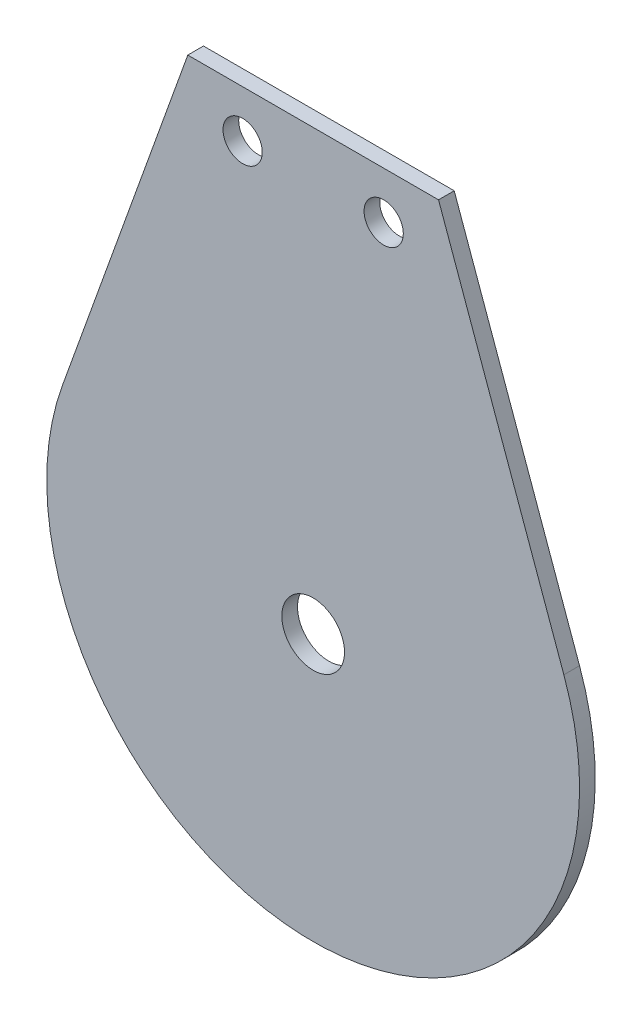
ISO-10303-21;
HEADER;
FILE_DESCRIPTION(('STEP AP214'),'2;1');
FILE_NAME('part.step','',(''),(''),'','','');
FILE_SCHEMA(('AUTOMOTIVE_DESIGN { 1 0 10303 214 1 1 1 1 }'));
ENDSEC;
DATA;
#1=APPLICATION_CONTEXT('core data for automotive mechanical design processes');
#2=APPLICATION_PROTOCOL_DEFINITION('international standard','automotive_design',2000,#1);
#3=PRODUCT_CONTEXT('',#1,'mechanical');
#4=PRODUCT('Part','Part','',(#3));
#5=PRODUCT_RELATED_PRODUCT_CATEGORY('part','',(#4));
#6=PRODUCT_DEFINITION_FORMATION('','',#4);
#7=PRODUCT_DEFINITION_CONTEXT('part definition',#1,'design');
#8=PRODUCT_DEFINITION('design','',#6,#7);
#9=PRODUCT_DEFINITION_SHAPE('','',#8);
#10=(LENGTH_UNIT() NAMED_UNIT(*) SI_UNIT(.MILLI.,.METRE.));
#11=(NAMED_UNIT(*) PLANE_ANGLE_UNIT() SI_UNIT($,.RADIAN.));
#12=(NAMED_UNIT(*) SI_UNIT($,.STERADIAN.) SOLID_ANGLE_UNIT());
#13=UNCERTAINTY_MEASURE_WITH_UNIT(LENGTH_MEASURE(1.E-05),#10,'distance_accuracy_value','');
#14=(GEOMETRIC_REPRESENTATION_CONTEXT(3) GLOBAL_UNCERTAINTY_ASSIGNED_CONTEXT((#13)) GLOBAL_UNIT_ASSIGNED_CONTEXT((#10,
#11,#12)) REPRESENTATION_CONTEXT('',''));
#15=CARTESIAN_POINT('',(0.,0.,0.));
#16=DIRECTION('',(0.,0.,1.));
#17=DIRECTION('',(1.,0.,0.));
#18=AXIS2_PLACEMENT_3D('',#15,#16,#17);
#19=CARTESIAN_POINT('',(0.,0.,3.175));
#20=DIRECTION('',(0.,0.,1.));
#21=DIRECTION('',(1.,0.,0.));
#22=AXIS2_PLACEMENT_3D('',#19,#20,#21);
#23=PLANE('',#22);
#24=CARTESIAN_POINT('',(0.,0.,3.175));
#25=DIRECTION('',(0.,0.,1.));
#26=DIRECTION('',(1.,0.,0.));
#27=AXIS2_PLACEMENT_3D('',#24,#25,#26);
#28=CIRCLE('',#27,6.35);
#29=CARTESIAN_POINT('',(6.35,0.,3.175));
#30=VERTEX_POINT('',#29);
#31=EDGE_CURVE('E138',#30,#30,#28,.T.);
#32=ORIENTED_EDGE('',*,*,#31,.F.);
#33=EDGE_LOOP('',(#32));
#34=FACE_BOUND('',#33,.T.);
#35=CARTESIAN_POINT('',(0.,0.,3.175));
#36=DIRECTION('',(0.,0.,1.));
#37=DIRECTION('',(1.,0.,0.));
#38=AXIS2_PLACEMENT_3D('',#35,#36,#37);
#39=CIRCLE('',#38,53.975);
#40=CARTESIAN_POINT('',(-50.7930886745837,18.2582246644046,3.175));
#41=VERTEX_POINT('',#40);
#42=CARTESIAN_POINT('',(50.7930886745837,18.2582246644046,3.175));
#43=VERTEX_POINT('',#42);
#44=EDGE_CURVE('E96',#41,#43,#39,.T.);
#45=ORIENTED_EDGE('',*,*,#44,.T.);
#46=DIRECTION('',(-0.338271878914398,0.941048423799606,0.));
#47=VECTOR('',#46,1.);
#48=CARTESIAN_POINT('',(25.4,88.9,3.175));
#49=LINE('',#48,#47);
#50=CARTESIAN_POINT('',(25.4,88.9,3.175));
#51=VERTEX_POINT('',#50);
#52=EDGE_CURVE('E91',#43,#51,#49,.T.);
#53=ORIENTED_EDGE('',*,*,#52,.T.);
#54=DIRECTION('',(-1.,0.,0.));
#55=VECTOR('',#54,1.);
#56=CARTESIAN_POINT('',(-25.4,88.9,3.175));
#57=LINE('',#56,#55);
#58=CARTESIAN_POINT('',(-25.4,88.9,3.175));
#59=VERTEX_POINT('',#58);
#60=EDGE_CURVE('E94',#51,#59,#57,.T.);
#61=ORIENTED_EDGE('',*,*,#60,.T.);
#62=DIRECTION('',(-0.338271878914398,-0.941048423799606,0.));
#63=VECTOR('',#62,1.);
#64=CARTESIAN_POINT('',(-25.4,88.9,3.175));
#65=LINE('',#64,#63);
#66=EDGE_CURVE('E61',#59,#41,#65,.T.);
#67=ORIENTED_EDGE('',*,*,#66,.T.);
#68=EDGE_LOOP('',(#45,#53,#61,#67));
#69=FACE_BOUND('',#68,.T.);
#70=CARTESIAN_POINT('',(14.2875,79.375,3.175));
#71=DIRECTION('',(0.,0.,1.));
#72=DIRECTION('',(1.,0.,0.));
#73=AXIS2_PLACEMENT_3D('',#70,#71,#72);
#74=CIRCLE('',#73,3.9751);
#75=CARTESIAN_POINT('',(18.2626,79.375,3.175));
#76=VERTEX_POINT('',#75);
#77=EDGE_CURVE('E116',#76,#76,#74,.T.);
#78=ORIENTED_EDGE('',*,*,#77,.F.);
#79=EDGE_LOOP('',(#78));
#80=FACE_BOUND('',#79,.T.);
#81=CARTESIAN_POINT('',(-14.2875,79.375,3.175));
#82=DIRECTION('',(0.,0.,1.));
#83=DIRECTION('',(-1.,0.,0.));
#84=AXIS2_PLACEMENT_3D('',#81,#82,#83);
#85=CIRCLE('',#84,3.9751);
#86=CARTESIAN_POINT('',(-18.2626,79.375,3.175));
#87=VERTEX_POINT('',#86);
#88=EDGE_CURVE('E146',#87,#87,#85,.T.);
#89=ORIENTED_EDGE('',*,*,#88,.F.);
#90=EDGE_LOOP('',(#89));
#91=FACE_BOUND('',#90,.T.);
#92=ADVANCED_FACE('F43',(#34,#69,#80,#91),#23,.T.);
#93=CARTESIAN_POINT('',(0.,0.,0.));
#94=DIRECTION('',(0.,0.,1.));
#95=DIRECTION('',(1.,0.,0.));
#96=AXIS2_PLACEMENT_3D('',#93,#94,#95);
#97=PLANE('',#96);
#98=CARTESIAN_POINT('',(0.,0.,0.));
#99=DIRECTION('',(0.,0.,1.));
#100=DIRECTION('',(1.,0.,0.));
#101=AXIS2_PLACEMENT_3D('',#98,#99,#100);
#102=CIRCLE('',#101,53.975);
#103=CARTESIAN_POINT('',(-50.7930886745837,18.2582246644046,0.));
#104=VERTEX_POINT('',#103);
#105=CARTESIAN_POINT('',(50.7930886745837,18.2582246644046,0.));
#106=VERTEX_POINT('',#105);
#107=EDGE_CURVE('E112',#104,#106,#102,.T.);
#108=ORIENTED_EDGE('',*,*,#107,.F.);
#109=DIRECTION('',(-0.338271878914398,-0.941048423799606,0.));
#110=VECTOR('',#109,1.);
#111=CARTESIAN_POINT('',(-25.4,88.9,0.));
#112=LINE('',#111,#110);
#113=CARTESIAN_POINT('',(-25.4,88.9,0.));
#114=VERTEX_POINT('',#113);
#115=EDGE_CURVE('E84',#114,#104,#112,.T.);
#116=ORIENTED_EDGE('',*,*,#115,.F.);
#117=DIRECTION('',(-1.,0.,0.));
#118=VECTOR('',#117,1.);
#119=CARTESIAN_POINT('',(-25.4,88.9,0.));
#120=LINE('',#119,#118);
#121=CARTESIAN_POINT('',(25.4,88.9,0.));
#122=VERTEX_POINT('',#121);
#123=EDGE_CURVE('E78',#122,#114,#120,.T.);
#124=ORIENTED_EDGE('',*,*,#123,.F.);
#125=DIRECTION('',(-0.338271878914398,0.941048423799606,0.));
#126=VECTOR('',#125,1.);
#127=CARTESIAN_POINT('',(25.4,88.9,0.));
#128=LINE('',#127,#126);
#129=EDGE_CURVE('E101',#106,#122,#128,.T.);
#130=ORIENTED_EDGE('',*,*,#129,.F.);
#131=EDGE_LOOP('',(#108,#116,#124,#130));
#132=FACE_BOUND('',#131,.T.);
#133=CARTESIAN_POINT('',(14.2875,79.375,0.));
#134=DIRECTION('',(0.,0.,1.));
#135=DIRECTION('',(1.,0.,0.));
#136=AXIS2_PLACEMENT_3D('',#133,#134,#135);
#137=CIRCLE('',#136,3.9751);
#138=CARTESIAN_POINT('',(18.2626,79.375,0.));
#139=VERTEX_POINT('',#138);
#140=EDGE_CURVE('E134',#139,#139,#137,.T.);
#141=ORIENTED_EDGE('',*,*,#140,.T.);
#142=EDGE_LOOP('',(#141));
#143=FACE_BOUND('',#142,.T.);
#144=CARTESIAN_POINT('',(0.,0.,0.));
#145=DIRECTION('',(0.,0.,1.));
#146=DIRECTION('',(1.,0.,0.));
#147=AXIS2_PLACEMENT_3D('',#144,#145,#146);
#148=CIRCLE('',#147,6.35);
#149=CARTESIAN_POINT('',(6.35,0.,0.));
#150=VERTEX_POINT('',#149);
#151=EDGE_CURVE('E142',#150,#150,#148,.T.);
#152=ORIENTED_EDGE('',*,*,#151,.T.);
#153=EDGE_LOOP('',(#152));
#154=FACE_BOUND('',#153,.T.);
#155=CARTESIAN_POINT('',(-14.2875,79.375,0.));
#156=DIRECTION('',(0.,0.,1.));
#157=DIRECTION('',(-1.,0.,0.));
#158=AXIS2_PLACEMENT_3D('',#155,#156,#157);
#159=CIRCLE('',#158,3.9751);
#160=CARTESIAN_POINT('',(-18.2626,79.375,0.));
#161=VERTEX_POINT('',#160);
#162=EDGE_CURVE('E150',#161,#161,#159,.T.);
#163=ORIENTED_EDGE('',*,*,#162,.T.);
#164=EDGE_LOOP('',(#163));
#165=FACE_BOUND('',#164,.T.);
#166=ADVANCED_FACE('F129',(#132,#143,#154,#165),#97,.F.);
#167=CARTESIAN_POINT('',(0.,0.,3.175));
#168=DIRECTION('',(0.,0.,-1.));
#169=DIRECTION('',(-1.,0.,0.));
#170=AXIS2_PLACEMENT_3D('',#167,#168,#169);
#171=CYLINDRICAL_SURFACE('',#170,53.975);
#172=ORIENTED_EDGE('',*,*,#107,.T.);
#173=DIRECTION('',(0.,0.,-1.));
#174=VECTOR('',#173,1.);
#175=CARTESIAN_POINT('',(50.7930886745837,18.2582246644046,3.175));
#176=LINE('',#175,#174);
#177=EDGE_CURVE('E11',#43,#106,#176,.T.);
#178=ORIENTED_EDGE('',*,*,#177,.F.);
#179=ORIENTED_EDGE('',*,*,#44,.F.);
#180=DIRECTION('',(0.,0.,-1.));
#181=VECTOR('',#180,1.);
#182=CARTESIAN_POINT('',(-50.7930886745837,18.2582246644046,3.175));
#183=LINE('',#182,#181);
#184=EDGE_CURVE('E108',#41,#104,#183,.T.);
#185=ORIENTED_EDGE('',*,*,#184,.T.);
#186=EDGE_LOOP('',(#172,#178,#179,#185));
#187=FACE_BOUND('',#186,.T.);
#188=ADVANCED_FACE('F45',(#187),#171,.T.);
#189=CARTESIAN_POINT('',(25.4,88.9,3.175));
#190=DIRECTION('',(-0.941048423799606,-0.338271878914398,0.));
#191=DIRECTION('',(0.338271878914398,-0.941048423799606,0.));
#192=AXIS2_PLACEMENT_3D('',#189,#190,#191);
#193=PLANE('',#192);
#194=ORIENTED_EDGE('',*,*,#129,.T.);
#195=DIRECTION('',(0.,0.,-1.));
#196=VECTOR('',#195,1.);
#197=CARTESIAN_POINT('',(25.4,88.9,3.175));
#198=LINE('',#197,#196);
#199=EDGE_CURVE('E53',#51,#122,#198,.T.);
#200=ORIENTED_EDGE('',*,*,#199,.F.);
#201=ORIENTED_EDGE('',*,*,#52,.F.);
#202=ORIENTED_EDGE('',*,*,#177,.T.);
#203=EDGE_LOOP('',(#194,#200,#201,#202));
#204=FACE_BOUND('',#203,.T.);
#205=ADVANCED_FACE('F100',(#204),#193,.F.);
#206=CARTESIAN_POINT('',(-25.4,88.9,3.175));
#207=DIRECTION('',(0.,-1.,0.));
#208=DIRECTION('',(0.,0.,-1.));
#209=AXIS2_PLACEMENT_3D('',#206,#207,#208);
#210=PLANE('',#209);
#211=ORIENTED_EDGE('',*,*,#123,.T.);
#212=DIRECTION('',(0.,0.,-1.));
#213=VECTOR('',#212,1.);
#214=CARTESIAN_POINT('',(-25.4,88.9,3.175));
#215=LINE('',#214,#213);
#216=EDGE_CURVE('E103',#59,#114,#215,.T.);
#217=ORIENTED_EDGE('',*,*,#216,.F.);
#218=ORIENTED_EDGE('',*,*,#60,.F.);
#219=ORIENTED_EDGE('',*,*,#199,.T.);
#220=EDGE_LOOP('',(#211,#217,#218,#219));
#221=FACE_BOUND('',#220,.T.);
#222=ADVANCED_FACE('F104',(#221),#210,.F.);
#223=CARTESIAN_POINT('',(-25.4,88.9,3.175));
#224=DIRECTION('',(0.941048423799606,-0.338271878914398,0.));
#225=DIRECTION('',(0.338271878914398,0.941048423799606,0.));
#226=AXIS2_PLACEMENT_3D('',#223,#224,#225);
#227=PLANE('',#226);
#228=ORIENTED_EDGE('',*,*,#115,.T.);
#229=ORIENTED_EDGE('',*,*,#184,.F.);
#230=ORIENTED_EDGE('',*,*,#66,.F.);
#231=ORIENTED_EDGE('',*,*,#216,.T.);
#232=EDGE_LOOP('',(#228,#229,#230,#231));
#233=FACE_BOUND('',#232,.T.);
#234=ADVANCED_FACE('F126',(#233),#227,.F.);
#235=CARTESIAN_POINT('',(14.2875,79.375,3.175));
#236=DIRECTION('',(0.,0.,-1.));
#237=DIRECTION('',(-1.,0.,0.));
#238=AXIS2_PLACEMENT_3D('',#235,#236,#237);
#239=CYLINDRICAL_SURFACE('',#238,3.9751);
#240=ORIENTED_EDGE('',*,*,#77,.T.);
#241=EDGE_LOOP('',(#240));
#242=FACE_BOUND('',#241,.T.);
#243=ORIENTED_EDGE('',*,*,#140,.F.);
#244=EDGE_LOOP('',(#243));
#245=FACE_BOUND('',#244,.T.);
#246=ADVANCED_FACE('F170',(#242,#245),#239,.F.);
#247=CARTESIAN_POINT('',(0.,0.,3.175));
#248=DIRECTION('',(0.,0.,-1.));
#249=DIRECTION('',(-1.,0.,0.));
#250=AXIS2_PLACEMENT_3D('',#247,#248,#249);
#251=CYLINDRICAL_SURFACE('',#250,6.35);
#252=ORIENTED_EDGE('',*,*,#31,.T.);
#253=EDGE_LOOP('',(#252));
#254=FACE_BOUND('',#253,.T.);
#255=ORIENTED_EDGE('',*,*,#151,.F.);
#256=EDGE_LOOP('',(#255));
#257=FACE_BOUND('',#256,.T.);
#258=ADVANCED_FACE('F224',(#254,#257),#251,.F.);
#259=CARTESIAN_POINT('',(-14.2875,79.375,3.175));
#260=DIRECTION('',(0.,0.,-1.));
#261=DIRECTION('',(-1.,0.,0.));
#262=AXIS2_PLACEMENT_3D('',#259,#260,#261);
#263=CYLINDRICAL_SURFACE('',#262,3.9751);
#264=ORIENTED_EDGE('',*,*,#88,.T.);
#265=EDGE_LOOP('',(#264));
#266=FACE_BOUND('',#265,.T.);
#267=ORIENTED_EDGE('',*,*,#162,.F.);
#268=EDGE_LOOP('',(#267));
#269=FACE_BOUND('',#268,.T.);
#270=ADVANCED_FACE('F158',(#266,#269),#263,.F.);
#271=CLOSED_SHELL('',(#92,#166,#188,#205,#222,#234,#246,#258,#270));
#272=MANIFOLD_SOLID_BREP('B2',#271);
#273=ADVANCED_BREP_SHAPE_REPRESENTATION('',(#18,#272),#14);
#274=SHAPE_DEFINITION_REPRESENTATION(#9,#273);
ENDSEC;
END-ISO-10303-21;
